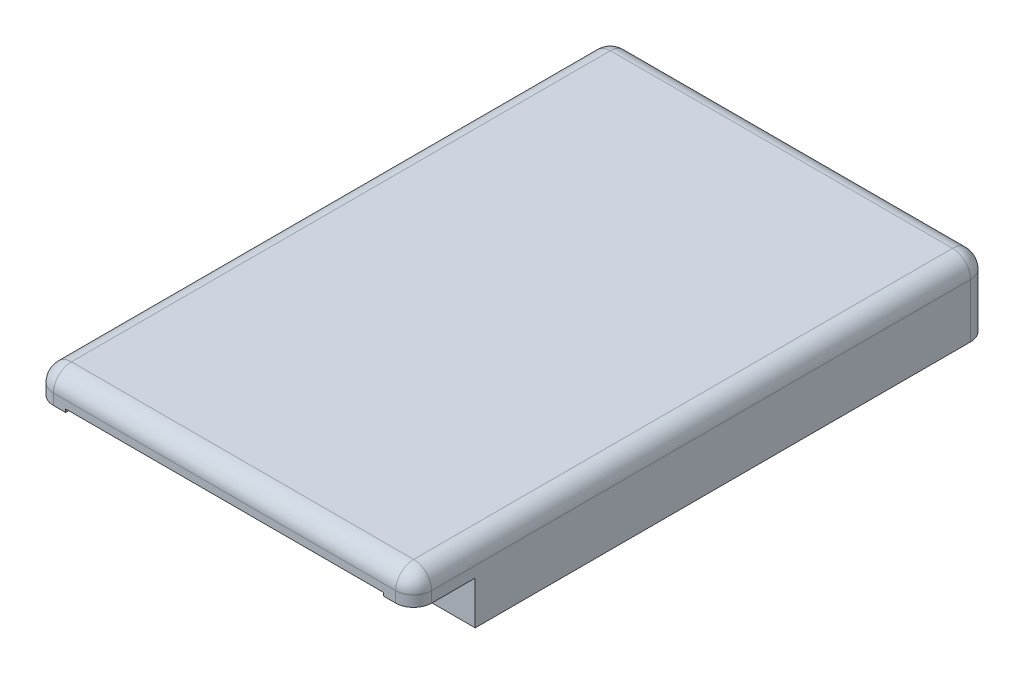
ISO-10303-21;
HEADER;
FILE_DESCRIPTION(('STEP AP214'),'2;1');
FILE_NAME('part.step','',(''),(''),'','','');
FILE_SCHEMA(('AUTOMOTIVE_DESIGN { 1 0 10303 214 1 1 1 1 }'));
ENDSEC;
DATA;
#1=APPLICATION_CONTEXT('core data for automotive mechanical design processes');
#2=APPLICATION_PROTOCOL_DEFINITION('international standard','automotive_design',2000,#1);
#3=PRODUCT_CONTEXT('',#1,'mechanical');
#4=PRODUCT('Part','Part','',(#3));
#5=PRODUCT_RELATED_PRODUCT_CATEGORY('part','',(#4));
#6=PRODUCT_DEFINITION_FORMATION('','',#4);
#7=PRODUCT_DEFINITION_CONTEXT('part definition',#1,'design');
#8=PRODUCT_DEFINITION('design','',#6,#7);
#9=PRODUCT_DEFINITION_SHAPE('','',#8);
#10=(LENGTH_UNIT() NAMED_UNIT(*) SI_UNIT(.MILLI.,.METRE.));
#11=(NAMED_UNIT(*) PLANE_ANGLE_UNIT() SI_UNIT($,.RADIAN.));
#12=(NAMED_UNIT(*) SI_UNIT($,.STERADIAN.) SOLID_ANGLE_UNIT());
#13=UNCERTAINTY_MEASURE_WITH_UNIT(LENGTH_MEASURE(1.E-05),#10,'distance_accuracy_value','');
#14=(GEOMETRIC_REPRESENTATION_CONTEXT(3) GLOBAL_UNCERTAINTY_ASSIGNED_CONTEXT((#13)) GLOBAL_UNIT_ASSIGNED_CONTEXT((#10,
#11,#12)) REPRESENTATION_CONTEXT('',''));
#15=CARTESIAN_POINT('',(0.,0.,0.));
#16=DIRECTION('',(0.,0.,1.));
#17=DIRECTION('',(1.,0.,0.));
#18=AXIS2_PLACEMENT_3D('',#15,#16,#17);
#19=CARTESIAN_POINT('',(0.,2.35,63.83));
#20=DIRECTION('',(-1.,0.,0.));
#21=DIRECTION('',(0.,0.,1.));
#22=AXIS2_PLACEMENT_3D('',#19,#20,#21);
#23=PLANE('',#22);
#24=DIRECTION('',(0.,0.,-1.));
#25=VECTOR('',#24,1.);
#26=CARTESIAN_POINT('',(0.,2.35,63.83));
#27=LINE('',#26,#25);
#28=CARTESIAN_POINT('',(0.,2.35,57.));
#29=VERTEX_POINT('',#28);
#30=CARTESIAN_POINT('',(0.,2.35,0.));
#31=VERTEX_POINT('',#30);
#32=EDGE_CURVE('E230',#29,#31,#27,.T.);
#33=ORIENTED_EDGE('',*,*,#32,.F.);
#34=DIRECTION('',(0.,-1.,0.));
#35=VECTOR('',#34,1.);
#36=CARTESIAN_POINT('',(0.,2.35,57.));
#37=LINE('',#36,#35);
#38=CARTESIAN_POINT('',(0.,0.,57.));
#39=VERTEX_POINT('',#38);
#40=EDGE_CURVE('E337',#29,#39,#37,.T.);
#41=ORIENTED_EDGE('',*,*,#40,.T.);
#42=DIRECTION('',(0.,0.,-1.));
#43=VECTOR('',#42,1.);
#44=CARTESIAN_POINT('',(0.,0.,63.83));
#45=LINE('',#44,#43);
#46=CARTESIAN_POINT('',(0.,0.,0.));
#47=VERTEX_POINT('',#46);
#48=EDGE_CURVE('E202',#39,#47,#45,.T.);
#49=ORIENTED_EDGE('',*,*,#48,.T.);
#50=DIRECTION('',(0.,1.,0.));
#51=VECTOR('',#50,1.);
#52=CARTESIAN_POINT('',(0.,2.35,0.));
#53=LINE('',#52,#51);
#54=EDGE_CURVE('E339',#47,#31,#53,.T.);
#55=ORIENTED_EDGE('',*,*,#54,.T.);
#56=EDGE_LOOP('',(#33,#41,#49,#55));
#57=FACE_BOUND('',#56,.T.);
#58=ADVANCED_FACE('F32',(#57),#23,.F.);
#59=CARTESIAN_POINT('',(-4.45,2.35,63.83));
#60=DIRECTION('',(0.,-1.,0.));
#61=DIRECTION('',(0.,0.,-1.));
#62=AXIS2_PLACEMENT_3D('',#59,#60,#61);
#63=PLANE('',#62);
#64=DIRECTION('',(0.,0.,-1.));
#65=VECTOR('',#64,1.);
#66=CARTESIAN_POINT('',(-4.45,2.35,63.83));
#67=LINE('',#66,#65);
#68=CARTESIAN_POINT('',(-4.45,2.35,57.));
#69=VERTEX_POINT('',#68);
#70=CARTESIAN_POINT('',(-4.45,2.35,0.));
#71=VERTEX_POINT('',#70);
#72=EDGE_CURVE('E228',#69,#71,#67,.T.);
#73=ORIENTED_EDGE('',*,*,#72,.F.);
#74=DIRECTION('',(1.,0.,0.));
#75=VECTOR('',#74,1.);
#76=CARTESIAN_POINT('',(-4.45,2.35,57.));
#77=LINE('',#76,#75);
#78=EDGE_CURVE('E334',#69,#29,#77,.T.);
#79=ORIENTED_EDGE('',*,*,#78,.T.);
#80=ORIENTED_EDGE('',*,*,#32,.T.);
#81=DIRECTION('',(-1.,0.,0.));
#82=VECTOR('',#81,1.);
#83=CARTESIAN_POINT('',(-4.45,2.35,0.));
#84=LINE('',#83,#82);
#85=EDGE_CURVE('E349',#31,#71,#84,.T.);
#86=ORIENTED_EDGE('',*,*,#85,.T.);
#87=EDGE_LOOP('',(#73,#79,#80,#86));
#88=FACE_BOUND('',#87,.T.);
#89=ADVANCED_FACE('F376',(#88),#63,.F.);
#90=CARTESIAN_POINT('',(-4.45,5.15,63.83));
#91=DIRECTION('',(-1.,0.,0.));
#92=DIRECTION('',(0.,0.,1.));
#93=AXIS2_PLACEMENT_3D('',#90,#91,#92);
#94=PLANE('',#93);
#95=DIRECTION('',(0.,1.,0.));
#96=VECTOR('',#95,1.);
#97=CARTESIAN_POINT('',(-4.45,5.15,63.83));
#98=LINE('',#97,#96);
#99=CARTESIAN_POINT('',(-4.45,4.8,63.83));
#100=VERTEX_POINT('',#99);
#101=CARTESIAN_POINT('',(-4.45,5.15,63.83));
#102=VERTEX_POINT('',#101);
#103=EDGE_CURVE('E340',#100,#102,#98,.T.);
#104=ORIENTED_EDGE('',*,*,#103,.F.);
#105=DIRECTION('',(0.,0.,-1.));
#106=VECTOR('',#105,1.);
#107=CARTESIAN_POINT('',(-4.45,4.8,63.83));
#108=LINE('',#107,#106);
#109=CARTESIAN_POINT('',(-4.45,4.8,57.));
#110=VERTEX_POINT('',#109);
#111=EDGE_CURVE('E319',#100,#110,#108,.T.);
#112=ORIENTED_EDGE('',*,*,#111,.T.);
#113=DIRECTION('',(0.,-1.,0.));
#114=VECTOR('',#113,1.);
#115=CARTESIAN_POINT('',(-4.45,5.15,57.));
#116=LINE('',#115,#114);
#117=EDGE_CURVE('E331',#110,#69,#116,.T.);
#118=ORIENTED_EDGE('',*,*,#117,.T.);
#119=ORIENTED_EDGE('',*,*,#72,.T.);
#120=DIRECTION('',(0.,1.,0.));
#121=VECTOR('',#120,1.);
#122=CARTESIAN_POINT('',(-4.45,5.15,0.));
#123=LINE('',#122,#121);
#124=CARTESIAN_POINT('',(-4.45,5.15,0.));
#125=VERTEX_POINT('',#124);
#126=EDGE_CURVE('E352',#71,#125,#123,.T.);
#127=ORIENTED_EDGE('',*,*,#126,.T.);
#128=DIRECTION('',(0.,0.,-1.));
#129=VECTOR('',#128,1.);
#130=CARTESIAN_POINT('',(-4.45,5.15,63.83));
#131=LINE('',#130,#129);
#132=EDGE_CURVE('E225',#102,#125,#131,.T.);
#133=ORIENTED_EDGE('',*,*,#132,.F.);
#134=EDGE_LOOP('',(#104,#112,#118,#119,#127,#133));
#135=FACE_BOUND('',#134,.T.);
#136=ADVANCED_FACE('F379',(#135),#94,.F.);
#137=CARTESIAN_POINT('',(-4.45,5.15,63.83));
#138=DIRECTION('',(0.,1.,0.));
#139=DIRECTION('',(0.,0.,1.));
#140=AXIS2_PLACEMENT_3D('',#137,#138,#139);
#141=PLANE('',#140);
#142=DIRECTION('',(1.,0.,0.));
#143=VECTOR('',#142,1.);
#144=CARTESIAN_POINT('',(-4.45,5.15,0.));
#145=LINE('',#144,#143);
#146=CARTESIAN_POINT('',(30.85,5.15,0.));
#147=VERTEX_POINT('',#146);
#148=EDGE_CURVE('E354',#125,#147,#145,.T.);
#149=ORIENTED_EDGE('',*,*,#148,.T.);
#150=DIRECTION('',(0.,0.,-1.));
#151=VECTOR('',#150,1.);
#152=CARTESIAN_POINT('',(30.85,5.15,63.83));
#153=LINE('',#152,#151);
#154=CARTESIAN_POINT('',(30.85,5.15,63.83));
#155=VERTEX_POINT('',#154);
#156=EDGE_CURVE('E222',#155,#147,#153,.T.);
#157=ORIENTED_EDGE('',*,*,#156,.F.);
#158=DIRECTION('',(1.,0.,0.));
#159=VECTOR('',#158,1.);
#160=CARTESIAN_POINT('',(-4.45,5.15,63.83));
#161=LINE('',#160,#159);
#162=EDGE_CURVE('E342',#102,#155,#161,.T.);
#163=ORIENTED_EDGE('',*,*,#162,.F.);
#164=ORIENTED_EDGE('',*,*,#132,.T.);
#165=EDGE_LOOP('',(#149,#157,#163,#164));
#166=FACE_BOUND('',#165,.T.);
#167=ADVANCED_FACE('F665',(#166),#141,.F.);
#168=CARTESIAN_POINT('',(30.85,5.15,63.83));
#169=DIRECTION('',(1.,0.,0.));
#170=DIRECTION('',(0.,0.,-1.));
#171=AXIS2_PLACEMENT_3D('',#168,#169,#170);
#172=PLANE('',#171);
#173=DIRECTION('',(0.,1.,0.));
#174=VECTOR('',#173,1.);
#175=CARTESIAN_POINT('',(30.85,5.15,57.));
#176=LINE('',#175,#174);
#177=CARTESIAN_POINT('',(30.85,2.35,57.));
#178=VERTEX_POINT('',#177);
#179=CARTESIAN_POINT('',(30.85,4.8,57.));
#180=VERTEX_POINT('',#179);
#181=EDGE_CURVE('E328',#178,#180,#176,.T.);
#182=ORIENTED_EDGE('',*,*,#181,.T.);
#183=DIRECTION('',(0.,0.,1.));
#184=VECTOR('',#183,1.);
#185=CARTESIAN_POINT('',(30.85,4.8,63.83));
#186=LINE('',#185,#184);
#187=CARTESIAN_POINT('',(30.85,4.8,63.83));
#188=VERTEX_POINT('',#187);
#189=EDGE_CURVE('E314',#180,#188,#186,.T.);
#190=ORIENTED_EDGE('',*,*,#189,.T.);
#191=DIRECTION('',(0.,-1.,0.));
#192=VECTOR('',#191,1.);
#193=CARTESIAN_POINT('',(30.85,5.15,63.83));
#194=LINE('',#193,#192);
#195=EDGE_CURVE('E213',#155,#188,#194,.T.);
#196=ORIENTED_EDGE('',*,*,#195,.F.);
#197=ORIENTED_EDGE('',*,*,#156,.T.);
#198=DIRECTION('',(0.,-1.,0.));
#199=VECTOR('',#198,1.);
#200=CARTESIAN_POINT('',(30.85,5.15,0.));
#201=LINE('',#200,#199);
#202=CARTESIAN_POINT('',(30.85,2.35,0.));
#203=VERTEX_POINT('',#202);
#204=EDGE_CURVE('E356',#147,#203,#201,.T.);
#205=ORIENTED_EDGE('',*,*,#204,.T.);
#206=DIRECTION('',(0.,0.,-1.));
#207=VECTOR('',#206,1.);
#208=CARTESIAN_POINT('',(30.85,2.35,63.83));
#209=LINE('',#208,#207);
#210=EDGE_CURVE('E220',#178,#203,#209,.T.);
#211=ORIENTED_EDGE('',*,*,#210,.F.);
#212=EDGE_LOOP('',(#182,#190,#196,#197,#205,#211));
#213=FACE_BOUND('',#212,.T.);
#214=ADVANCED_FACE('F411',(#213),#172,.F.);
#215=CARTESIAN_POINT('',(30.85,2.35,63.83));
#216=DIRECTION('',(0.,-1.,0.));
#217=DIRECTION('',(1.,0.,0.));
#218=AXIS2_PLACEMENT_3D('',#215,#216,#217);
#219=PLANE('',#218);
#220=DIRECTION('',(0.,0.,-1.));
#221=VECTOR('',#220,1.);
#222=CARTESIAN_POINT('',(26.4,2.35,63.83));
#223=LINE('',#222,#221);
#224=CARTESIAN_POINT('',(26.4,2.35,57.));
#225=VERTEX_POINT('',#224);
#226=CARTESIAN_POINT('',(26.4,2.35,0.));
#227=VERTEX_POINT('',#226);
#228=EDGE_CURVE('E218',#225,#227,#223,.T.);
#229=ORIENTED_EDGE('',*,*,#228,.F.);
#230=DIRECTION('',(1.,0.,0.));
#231=VECTOR('',#230,1.);
#232=CARTESIAN_POINT('',(30.85,2.35,57.));
#233=LINE('',#232,#231);
#234=EDGE_CURVE('E325',#225,#178,#233,.T.);
#235=ORIENTED_EDGE('',*,*,#234,.T.);
#236=ORIENTED_EDGE('',*,*,#210,.T.);
#237=DIRECTION('',(-1.,0.,0.));
#238=VECTOR('',#237,1.);
#239=CARTESIAN_POINT('',(30.85,2.35,0.));
#240=LINE('',#239,#238);
#241=EDGE_CURVE('E359',#203,#227,#240,.T.);
#242=ORIENTED_EDGE('',*,*,#241,.T.);
#243=EDGE_LOOP('',(#229,#235,#236,#242));
#244=FACE_BOUND('',#243,.T.);
#245=ADVANCED_FACE('F416',(#244),#219,.F.);
#246=CARTESIAN_POINT('',(26.4,2.35,63.83));
#247=DIRECTION('',(1.,0.,0.));
#248=DIRECTION('',(0.,0.,-1.));
#249=AXIS2_PLACEMENT_3D('',#246,#247,#248);
#250=PLANE('',#249);
#251=DIRECTION('',(0.,0.,-1.));
#252=VECTOR('',#251,1.);
#253=CARTESIAN_POINT('',(26.4,0.,63.83));
#254=LINE('',#253,#252);
#255=CARTESIAN_POINT('',(26.4,0.,57.));
#256=VERTEX_POINT('',#255);
#257=CARTESIAN_POINT('',(26.4,0.,0.));
#258=VERTEX_POINT('',#257);
#259=EDGE_CURVE('E211',#256,#258,#254,.T.);
#260=ORIENTED_EDGE('',*,*,#259,.F.);
#261=DIRECTION('',(0.,1.,0.));
#262=VECTOR('',#261,1.);
#263=CARTESIAN_POINT('',(26.4,2.35,57.));
#264=LINE('',#263,#262);
#265=EDGE_CURVE('E322',#256,#225,#264,.T.);
#266=ORIENTED_EDGE('',*,*,#265,.T.);
#267=ORIENTED_EDGE('',*,*,#228,.T.);
#268=DIRECTION('',(0.,-1.,0.));
#269=VECTOR('',#268,1.);
#270=CARTESIAN_POINT('',(26.4,2.35,0.));
#271=LINE('',#270,#269);
#272=EDGE_CURVE('E362',#227,#258,#271,.T.);
#273=ORIENTED_EDGE('',*,*,#272,.T.);
#274=EDGE_LOOP('',(#260,#266,#267,#273));
#275=FACE_BOUND('',#274,.T.);
#276=ADVANCED_FACE('F421',(#275),#250,.F.);
#277=CARTESIAN_POINT('',(34.2,0.,63.83));
#278=DIRECTION('',(0.,1.,0.));
#279=DIRECTION('',(-1.,0.,0.));
#280=AXIS2_PLACEMENT_3D('',#277,#278,#279);
#281=PLANE('',#280);
#282=DIRECTION('',(1.,0.,0.));
#283=VECTOR('',#282,1.);
#284=CARTESIAN_POINT('',(34.2,0.,0.));
#285=LINE('',#284,#283);
#286=CARTESIAN_POINT('',(32.2,0.,0.));
#287=VERTEX_POINT('',#286);
#288=EDGE_CURVE('E365',#258,#287,#285,.T.);
#289=ORIENTED_EDGE('',*,*,#288,.T.);
#290=CARTESIAN_POINT('',(32.2,0.,2.));
#291=DIRECTION('',(0.,1.,0.));
#292=DIRECTION('',(-1.,0.,0.));
#293=AXIS2_PLACEMENT_3D('',#290,#291,#292);
#294=CIRCLE('',#293,2.);
#295=CARTESIAN_POINT('',(34.2,0.,2.));
#296=VERTEX_POINT('',#295);
#297=EDGE_CURVE('E267',#287,#296,#294,.F.);
#298=ORIENTED_EDGE('',*,*,#297,.T.);
#299=DIRECTION('',(0.,0.,-1.));
#300=VECTOR('',#299,1.);
#301=CARTESIAN_POINT('',(34.2,0.,63.83));
#302=LINE('',#301,#300);
#303=CARTESIAN_POINT('',(34.2,0.,57.));
#304=VERTEX_POINT('',#303);
#305=EDGE_CURVE('E208',#304,#296,#302,.T.);
#306=ORIENTED_EDGE('',*,*,#305,.F.);
#307=DIRECTION('',(1.,0.,0.));
#308=VECTOR('',#307,1.);
#309=CARTESIAN_POINT('',(34.2,0.,57.));
#310=LINE('',#309,#308);
#311=EDGE_CURVE('E192',#256,#304,#310,.T.);
#312=ORIENTED_EDGE('',*,*,#311,.F.);
#313=ORIENTED_EDGE('',*,*,#259,.T.);
#314=EDGE_LOOP('',(#289,#298,#306,#312,#313));
#315=FACE_BOUND('',#314,.T.);
#316=ADVANCED_FACE('F424',(#315),#281,.F.);
#317=CARTESIAN_POINT('',(34.2,8.,63.83));
#318=DIRECTION('',(-1.,0.,0.));
#319=DIRECTION('',(0.,-1.,0.));
#320=AXIS2_PLACEMENT_3D('',#317,#318,#319);
#321=PLANE('',#320);
#322=ORIENTED_EDGE('',*,*,#305,.T.);
#323=DIRECTION('',(0.,1.,0.));
#324=VECTOR('',#323,1.);
#325=CARTESIAN_POINT('',(34.2,8.,2.));
#326=LINE('',#325,#324);
#327=CARTESIAN_POINT('',(34.2,6.,2.));
#328=VERTEX_POINT('',#327);
#329=EDGE_CURVE('E248',#296,#328,#326,.T.);
#330=ORIENTED_EDGE('',*,*,#329,.T.);
#331=DIRECTION('',(0.,0.,-1.));
#332=VECTOR('',#331,1.);
#333=CARTESIAN_POINT('',(34.2,6.,63.83));
#334=LINE('',#333,#332);
#335=CARTESIAN_POINT('',(34.2,6.,61.83));
#336=VERTEX_POINT('',#335);
#337=EDGE_CURVE('E245',#328,#336,#334,.F.);
#338=ORIENTED_EDGE('',*,*,#337,.T.);
#339=DIRECTION('',(0.,1.,0.));
#340=VECTOR('',#339,1.);
#341=CARTESIAN_POINT('',(34.2,8.,61.83));
#342=LINE('',#341,#340);
#343=CARTESIAN_POINT('',(34.2,4.8,61.83));
#344=VERTEX_POINT('',#343);
#345=EDGE_CURVE('E243',#336,#344,#342,.F.);
#346=ORIENTED_EDGE('',*,*,#345,.T.);
#347=DIRECTION('',(0.,0.,1.));
#348=VECTOR('',#347,1.);
#349=CARTESIAN_POINT('',(34.2,4.8,57.));
#350=LINE('',#349,#348);
#351=CARTESIAN_POINT('',(34.2,4.8,57.));
#352=VERTEX_POINT('',#351);
#353=EDGE_CURVE('E315',#352,#344,#350,.T.);
#354=ORIENTED_EDGE('',*,*,#353,.F.);
#355=DIRECTION('',(0.,1.,0.));
#356=VECTOR('',#355,1.);
#357=CARTESIAN_POINT('',(34.2,4.8,57.));
#358=LINE('',#357,#356);
#359=EDGE_CURVE('E203',#304,#352,#358,.T.);
#360=ORIENTED_EDGE('',*,*,#359,.F.);
#361=EDGE_LOOP('',(#322,#330,#338,#346,#354,#360));
#362=FACE_BOUND('',#361,.T.);
#363=ADVANCED_FACE('F397',(#362),#321,.F.);
#364=CARTESIAN_POINT('',(-7.8,8.,63.83));
#365=DIRECTION('',(0.,-1.,0.));
#366=DIRECTION('',(0.,0.,-1.));
#367=AXIS2_PLACEMENT_3D('',#364,#365,#366);
#368=PLANE('',#367);
#369=DIRECTION('',(-1.,0.,0.));
#370=VECTOR('',#369,1.);
#371=CARTESIAN_POINT('',(-7.8,8.,61.83));
#372=LINE('',#371,#370);
#373=CARTESIAN_POINT('',(-5.8,8.,61.83));
#374=VERTEX_POINT('',#373);
#375=CARTESIAN_POINT('',(32.2,8.,61.83));
#376=VERTEX_POINT('',#375);
#377=EDGE_CURVE('E238',#374,#376,#372,.F.);
#378=ORIENTED_EDGE('',*,*,#377,.T.);
#379=DIRECTION('',(0.,0.,-1.));
#380=VECTOR('',#379,1.);
#381=CARTESIAN_POINT('',(32.2,8.,63.83));
#382=LINE('',#381,#380);
#383=CARTESIAN_POINT('',(32.2,8.,2.));
#384=VERTEX_POINT('',#383);
#385=EDGE_CURVE('E240',#376,#384,#382,.T.);
#386=ORIENTED_EDGE('',*,*,#385,.T.);
#387=DIRECTION('',(-1.,0.,0.));
#388=VECTOR('',#387,1.);
#389=CARTESIAN_POINT('',(-7.8,8.,2.));
#390=LINE('',#389,#388);
#391=CARTESIAN_POINT('',(-5.8,8.,2.));
#392=VERTEX_POINT('',#391);
#393=EDGE_CURVE('E234',#384,#392,#390,.T.);
#394=ORIENTED_EDGE('',*,*,#393,.T.);
#395=DIRECTION('',(0.,0.,-1.));
#396=VECTOR('',#395,1.);
#397=CARTESIAN_POINT('',(-5.8,8.,63.83));
#398=LINE('',#397,#396);
#399=EDGE_CURVE('E236',#392,#374,#398,.F.);
#400=ORIENTED_EDGE('',*,*,#399,.T.);
#401=EDGE_LOOP('',(#378,#386,#394,#400));
#402=FACE_BOUND('',#401,.T.);
#403=ADVANCED_FACE('F444',(#402),#368,.F.);
#404=CARTESIAN_POINT('',(-7.8,0.,63.83));
#405=DIRECTION('',(1.,0.,0.));
#406=DIRECTION('',(0.,1.,0.));
#407=AXIS2_PLACEMENT_3D('',#404,#405,#406);
#408=PLANE('',#407);
#409=DIRECTION('',(0.,0.,-1.));
#410=VECTOR('',#409,1.);
#411=CARTESIAN_POINT('',(-7.8,6.,63.83));
#412=LINE('',#411,#410);
#413=CARTESIAN_POINT('',(-7.8,6.,61.83));
#414=VERTEX_POINT('',#413);
#415=CARTESIAN_POINT('',(-7.8,6.,2.));
#416=VERTEX_POINT('',#415);
#417=EDGE_CURVE('E258',#414,#416,#412,.T.);
#418=ORIENTED_EDGE('',*,*,#417,.T.);
#419=DIRECTION('',(0.,-1.,0.));
#420=VECTOR('',#419,1.);
#421=CARTESIAN_POINT('',(-7.8,0.,2.));
#422=LINE('',#421,#420);
#423=CARTESIAN_POINT('',(-7.8,0.,2.));
#424=VERTEX_POINT('',#423);
#425=EDGE_CURVE('E207',#416,#424,#422,.T.);
#426=ORIENTED_EDGE('',*,*,#425,.T.);
#427=DIRECTION('',(0.,0.,-1.));
#428=VECTOR('',#427,1.);
#429=CARTESIAN_POINT('',(-7.8,0.,63.83));
#430=LINE('',#429,#428);
#431=CARTESIAN_POINT('',(-7.8,0.,57.));
#432=VERTEX_POINT('',#431);
#433=EDGE_CURVE('E199',#432,#424,#430,.T.);
#434=ORIENTED_EDGE('',*,*,#433,.F.);
#435=DIRECTION('',(0.,-1.,0.));
#436=VECTOR('',#435,1.);
#437=CARTESIAN_POINT('',(-7.8,0.,57.));
#438=LINE('',#437,#436);
#439=CARTESIAN_POINT('',(-7.8,4.8,57.));
#440=VERTEX_POINT('',#439);
#441=EDGE_CURVE('E181',#440,#432,#438,.T.);
#442=ORIENTED_EDGE('',*,*,#441,.F.);
#443=DIRECTION('',(0.,0.,1.));
#444=VECTOR('',#443,1.);
#445=CARTESIAN_POINT('',(-7.8,4.8,57.));
#446=LINE('',#445,#444);
#447=CARTESIAN_POINT('',(-7.8,4.8,61.83));
#448=VERTEX_POINT('',#447);
#449=EDGE_CURVE('E312',#440,#448,#446,.T.);
#450=ORIENTED_EDGE('',*,*,#449,.T.);
#451=DIRECTION('',(0.,-1.,0.));
#452=VECTOR('',#451,1.);
#453=CARTESIAN_POINT('',(-7.8,0.,61.83));
#454=LINE('',#453,#452);
#455=EDGE_CURVE('E256',#448,#414,#454,.F.);
#456=ORIENTED_EDGE('',*,*,#455,.T.);
#457=EDGE_LOOP('',(#418,#426,#434,#442,#450,#456));
#458=FACE_BOUND('',#457,.T.);
#459=ADVANCED_FACE('F205',(#458),#408,.F.);
#460=CARTESIAN_POINT('',(0.,0.,63.83));
#461=DIRECTION('',(0.,1.,0.));
#462=DIRECTION('',(-1.,0.,0.));
#463=AXIS2_PLACEMENT_3D('',#460,#461,#462);
#464=PLANE('',#463);
#465=ORIENTED_EDGE('',*,*,#433,.T.);
#466=CARTESIAN_POINT('',(-5.8,0.,2.));
#467=DIRECTION('',(0.,1.,0.));
#468=DIRECTION('',(-1.,0.,0.));
#469=AXIS2_PLACEMENT_3D('',#466,#467,#468);
#470=CIRCLE('',#469,2.);
#471=CARTESIAN_POINT('',(-5.8,0.,0.));
#472=VERTEX_POINT('',#471);
#473=EDGE_CURVE('E265',#424,#472,#470,.F.);
#474=ORIENTED_EDGE('',*,*,#473,.T.);
#475=DIRECTION('',(1.,0.,0.));
#476=VECTOR('',#475,1.);
#477=CARTESIAN_POINT('',(0.,0.,0.));
#478=LINE('',#477,#476);
#479=EDGE_CURVE('E343',#472,#47,#478,.T.);
#480=ORIENTED_EDGE('',*,*,#479,.T.);
#481=ORIENTED_EDGE('',*,*,#48,.F.);
#482=EDGE_CURVE('E184',#432,#39,#310,.T.);
#483=ORIENTED_EDGE('',*,*,#482,.F.);
#484=EDGE_LOOP('',(#465,#474,#480,#481,#483));
#485=FACE_BOUND('',#484,.T.);
#486=ADVANCED_FACE('F198',(#485),#464,.F.);
#487=CARTESIAN_POINT('',(0.,0.,63.83));
#488=DIRECTION('',(0.,0.,-1.));
#489=DIRECTION('',(-1.,0.,0.));
#490=AXIS2_PLACEMENT_3D('',#487,#488,#489);
#491=PLANE('',#490);
#492=DIRECTION('',(-1.,0.,0.));
#493=VECTOR('',#492,1.);
#494=CARTESIAN_POINT('',(0.,6.,63.83));
#495=LINE('',#494,#493);
#496=CARTESIAN_POINT('',(32.2,6.,63.83));
#497=VERTEX_POINT('',#496);
#498=CARTESIAN_POINT('',(-5.8,6.,63.83));
#499=VERTEX_POINT('',#498);
#500=EDGE_CURVE('E252',#497,#499,#495,.T.);
#501=ORIENTED_EDGE('',*,*,#500,.T.);
#502=DIRECTION('',(0.,-1.,0.));
#503=VECTOR('',#502,1.);
#504=CARTESIAN_POINT('',(-5.8,0.,63.83));
#505=LINE('',#504,#503);
#506=CARTESIAN_POINT('',(-5.8,4.8,63.83));
#507=VERTEX_POINT('',#506);
#508=EDGE_CURVE('E254',#499,#507,#505,.T.);
#509=ORIENTED_EDGE('',*,*,#508,.T.);
#510=DIRECTION('',(1.,0.,0.));
#511=VECTOR('',#510,1.);
#512=CARTESIAN_POINT('',(0.,4.8,63.83));
#513=LINE('',#512,#511);
#514=EDGE_CURVE('E232',#507,#100,#513,.T.);
#515=ORIENTED_EDGE('',*,*,#514,.T.);
#516=ORIENTED_EDGE('',*,*,#103,.T.);
#517=ORIENTED_EDGE('',*,*,#162,.T.);
#518=ORIENTED_EDGE('',*,*,#195,.T.);
#519=DIRECTION('',(-1.,0.,0.));
#520=VECTOR('',#519,1.);
#521=CARTESIAN_POINT('',(-7.8,4.8,63.83));
#522=LINE('',#521,#520);
#523=CARTESIAN_POINT('',(32.2,4.8,63.83));
#524=VERTEX_POINT('',#523);
#525=EDGE_CURVE('E193',#524,#188,#522,.T.);
#526=ORIENTED_EDGE('',*,*,#525,.F.);
#527=DIRECTION('',(0.,1.,0.));
#528=VECTOR('',#527,1.);
#529=CARTESIAN_POINT('',(32.2,0.,63.83));
#530=LINE('',#529,#528);
#531=EDGE_CURVE('E250',#524,#497,#530,.T.);
#532=ORIENTED_EDGE('',*,*,#531,.T.);
#533=EDGE_LOOP('',(#501,#509,#515,#516,#517,#518,#526,#532));
#534=FACE_BOUND('',#533,.T.);
#535=ADVANCED_FACE('F405',(#534),#491,.F.);
#536=CARTESIAN_POINT('',(0.,0.,0.));
#537=DIRECTION('',(0.,0.,-1.));
#538=DIRECTION('',(-1.,0.,0.));
#539=AXIS2_PLACEMENT_3D('',#536,#537,#538);
#540=PLANE('',#539);
#541=ORIENTED_EDGE('',*,*,#479,.F.);
#542=DIRECTION('',(0.,-1.,0.));
#543=VECTOR('',#542,1.);
#544=CARTESIAN_POINT('',(-5.8,8.,0.));
#545=LINE('',#544,#543);
#546=CARTESIAN_POINT('',(-5.8,6.,0.));
#547=VERTEX_POINT('',#546);
#548=EDGE_CURVE('E49',#472,#547,#545,.F.);
#549=ORIENTED_EDGE('',*,*,#548,.T.);
#550=DIRECTION('',(-1.,0.,0.));
#551=VECTOR('',#550,1.);
#552=CARTESIAN_POINT('',(34.2,6.,0.));
#553=LINE('',#552,#551);
#554=CARTESIAN_POINT('',(32.2,6.,0.));
#555=VERTEX_POINT('',#554);
#556=EDGE_CURVE('E54',#547,#555,#553,.F.);
#557=ORIENTED_EDGE('',*,*,#556,.T.);
#558=DIRECTION('',(0.,1.,0.));
#559=VECTOR('',#558,1.);
#560=CARTESIAN_POINT('',(32.2,0.,0.));
#561=LINE('',#560,#559);
#562=EDGE_CURVE('E261',#555,#287,#561,.F.);
#563=ORIENTED_EDGE('',*,*,#562,.T.);
#564=ORIENTED_EDGE('',*,*,#288,.F.);
#565=ORIENTED_EDGE('',*,*,#272,.F.);
#566=ORIENTED_EDGE('',*,*,#241,.F.);
#567=ORIENTED_EDGE('',*,*,#204,.F.);
#568=ORIENTED_EDGE('',*,*,#148,.F.);
#569=ORIENTED_EDGE('',*,*,#126,.F.);
#570=ORIENTED_EDGE('',*,*,#85,.F.);
#571=ORIENTED_EDGE('',*,*,#54,.F.);
#572=EDGE_LOOP('',(#541,#549,#557,#563,#564,#565,#566,#567,#568,#569,#570,#571));
#573=FACE_BOUND('',#572,.T.);
#574=ADVANCED_FACE('F371',(#573),#540,.T.);
#575=CARTESIAN_POINT('',(-7.8,4.8,57.));
#576=DIRECTION('',(0.,1.,0.));
#577=DIRECTION('',(0.,0.,1.));
#578=AXIS2_PLACEMENT_3D('',#575,#576,#577);
#579=PLANE('',#578);
#580=ORIENTED_EDGE('',*,*,#353,.T.);
#581=CARTESIAN_POINT('',(32.2,4.8,61.83));
#582=DIRECTION('',(0.,1.,0.));
#583=DIRECTION('',(0.,0.,1.));
#584=AXIS2_PLACEMENT_3D('',#581,#582,#583);
#585=CIRCLE('',#584,2.);
#586=EDGE_CURVE('E11',#344,#524,#585,.F.);
#587=ORIENTED_EDGE('',*,*,#586,.T.);
#588=ORIENTED_EDGE('',*,*,#525,.T.);
#589=ORIENTED_EDGE('',*,*,#189,.F.);
#590=DIRECTION('',(-1.,0.,0.));
#591=VECTOR('',#590,1.);
#592=CARTESIAN_POINT('',(-7.8,4.8,57.));
#593=LINE('',#592,#591);
#594=EDGE_CURVE('E310',#352,#180,#593,.T.);
#595=ORIENTED_EDGE('',*,*,#594,.F.);
#596=EDGE_LOOP('',(#580,#587,#588,#589,#595));
#597=FACE_BOUND('',#596,.T.);
#598=ADVANCED_FACE('F395',(#597),#579,.F.);
#599=CARTESIAN_POINT('',(0.,0.,57.));
#600=DIRECTION('',(0.,0.,-1.));
#601=DIRECTION('',(-1.,0.,0.));
#602=AXIS2_PLACEMENT_3D('',#599,#600,#601);
#603=PLANE('',#602);
#604=ORIENTED_EDGE('',*,*,#234,.F.);
#605=ORIENTED_EDGE('',*,*,#265,.F.);
#606=ORIENTED_EDGE('',*,*,#311,.T.);
#607=ORIENTED_EDGE('',*,*,#359,.T.);
#608=ORIENTED_EDGE('',*,*,#594,.T.);
#609=ORIENTED_EDGE('',*,*,#181,.F.);
#610=EDGE_LOOP('',(#604,#605,#606,#607,#608,#609));
#611=FACE_BOUND('',#610,.T.);
#612=ADVANCED_FACE('F390',(#611),#603,.F.);
#613=ORIENTED_EDGE('',*,*,#78,.F.);
#614=ORIENTED_EDGE('',*,*,#117,.F.);
#615=EDGE_CURVE('E187',#110,#440,#593,.T.);
#616=ORIENTED_EDGE('',*,*,#615,.T.);
#617=ORIENTED_EDGE('',*,*,#441,.T.);
#618=ORIENTED_EDGE('',*,*,#482,.T.);
#619=ORIENTED_EDGE('',*,*,#40,.F.);
#620=EDGE_LOOP('',(#613,#614,#616,#617,#618,#619));
#621=FACE_BOUND('',#620,.T.);
#622=ADVANCED_FACE('F183',(#621),#603,.F.);
#623=ORIENTED_EDGE('',*,*,#514,.F.);
#624=CARTESIAN_POINT('',(-5.8,4.8,61.83));
#625=DIRECTION('',(0.,1.,0.));
#626=DIRECTION('',(0.,0.,1.));
#627=AXIS2_PLACEMENT_3D('',#624,#625,#626);
#628=CIRCLE('',#627,2.);
#629=EDGE_CURVE('E41',#507,#448,#628,.F.);
#630=ORIENTED_EDGE('',*,*,#629,.T.);
#631=ORIENTED_EDGE('',*,*,#449,.F.);
#632=ORIENTED_EDGE('',*,*,#615,.F.);
#633=ORIENTED_EDGE('',*,*,#111,.F.);
#634=EDGE_LOOP('',(#623,#630,#631,#632,#633));
#635=FACE_BOUND('',#634,.T.);
#636=ADVANCED_FACE('F384',(#635),#579,.F.);
#637=CARTESIAN_POINT('',(-5.8,0.,61.83));
#638=DIRECTION('',(0.,-1.,0.));
#639=DIRECTION('',(1.,0.,0.));
#640=AXIS2_PLACEMENT_3D('',#637,#638,#639);
#641=CYLINDRICAL_SURFACE('',#640,2.);
#642=ORIENTED_EDGE('',*,*,#629,.F.);
#643=ORIENTED_EDGE('',*,*,#508,.F.);
#644=CARTESIAN_POINT('',(-5.8,6.,61.83));
#645=DIRECTION('',(0.,1.,0.));
#646=DIRECTION('',(0.,0.,1.));
#647=AXIS2_PLACEMENT_3D('',#644,#645,#646);
#648=CIRCLE('',#647,2.);
#649=EDGE_CURVE('E36',#414,#499,#648,.T.);
#650=ORIENTED_EDGE('',*,*,#649,.F.);
#651=ORIENTED_EDGE('',*,*,#455,.F.);
#652=EDGE_LOOP('',(#642,#643,#650,#651));
#653=FACE_BOUND('',#652,.T.);
#654=ADVANCED_FACE('F34',(#653),#641,.T.);
#655=CARTESIAN_POINT('',(-5.8,6.,63.83));
#656=DIRECTION('',(0.,0.,-1.));
#657=DIRECTION('',(-1.,0.,0.));
#658=AXIS2_PLACEMENT_3D('',#655,#656,#657);
#659=CYLINDRICAL_SURFACE('',#658,2.);
#660=CARTESIAN_POINT('',(-5.8,6.,2.));
#661=DIRECTION('',(0.,0.,-1.));
#662=DIRECTION('',(-1.,0.,0.));
#663=AXIS2_PLACEMENT_3D('',#660,#661,#662);
#664=CIRCLE('',#663,2.);
#665=EDGE_CURVE('E295',#416,#392,#664,.T.);
#666=ORIENTED_EDGE('',*,*,#665,.F.);
#667=ORIENTED_EDGE('',*,*,#417,.F.);
#668=CARTESIAN_POINT('',(-5.8,6.,61.83));
#669=DIRECTION('',(0.,0.,1.));
#670=DIRECTION('',(1.,0.,0.));
#671=AXIS2_PLACEMENT_3D('',#668,#669,#670);
#672=CIRCLE('',#671,2.);
#673=EDGE_CURVE('E297',#374,#414,#672,.T.);
#674=ORIENTED_EDGE('',*,*,#673,.F.);
#675=ORIENTED_EDGE('',*,*,#399,.F.);
#676=EDGE_LOOP('',(#666,#667,#674,#675));
#677=FACE_BOUND('',#676,.T.);
#678=ADVANCED_FACE('F537',(#677),#659,.T.);
#679=CARTESIAN_POINT('',(-5.8,0.,2.));
#680=DIRECTION('',(0.,1.,0.));
#681=DIRECTION('',(-1.,0.,0.));
#682=AXIS2_PLACEMENT_3D('',#679,#680,#681);
#683=CYLINDRICAL_SURFACE('',#682,2.);
#684=ORIENTED_EDGE('',*,*,#473,.F.);
#685=ORIENTED_EDGE('',*,*,#425,.F.);
#686=CARTESIAN_POINT('',(-5.8,6.,2.));
#687=DIRECTION('',(0.,1.,0.));
#688=DIRECTION('',(0.,0.,1.));
#689=AXIS2_PLACEMENT_3D('',#686,#687,#688);
#690=CIRCLE('',#689,2.);
#691=EDGE_CURVE('E292',#547,#416,#690,.T.);
#692=ORIENTED_EDGE('',*,*,#691,.F.);
#693=ORIENTED_EDGE('',*,*,#548,.F.);
#694=EDGE_LOOP('',(#684,#685,#692,#693));
#695=FACE_BOUND('',#694,.T.);
#696=ADVANCED_FACE('F528',(#695),#683,.T.);
#697=CARTESIAN_POINT('',(-5.8,6.,61.83));
#698=DIRECTION('',(0.,0.,1.));
#699=DIRECTION('',(1.,0.,0.));
#700=AXIS2_PLACEMENT_3D('',#697,#698,#699);
#701=SPHERICAL_SURFACE('',#700,2.);
#702=ORIENTED_EDGE('',*,*,#673,.T.);
#703=ORIENTED_EDGE('',*,*,#649,.T.);
#704=CARTESIAN_POINT('',(-5.8,6.,61.83));
#705=DIRECTION('',(-1.,0.,0.));
#706=DIRECTION('',(0.,0.,1.));
#707=AXIS2_PLACEMENT_3D('',#704,#705,#706);
#708=CIRCLE('',#707,2.);
#709=EDGE_CURVE('E289',#374,#499,#708,.F.);
#710=ORIENTED_EDGE('',*,*,#709,.F.);
#711=EDGE_LOOP('',(#702,#703,#710));
#712=FACE_BOUND('',#711,.T.);
#713=ADVANCED_FACE('F518',(#712),#701,.T.);
#714=CARTESIAN_POINT('',(-5.8,6.,2.));
#715=DIRECTION('',(0.,0.,1.));
#716=DIRECTION('',(1.,0.,0.));
#717=AXIS2_PLACEMENT_3D('',#714,#715,#716);
#718=SPHERICAL_SURFACE('',#717,2.);
#719=ORIENTED_EDGE('',*,*,#691,.T.);
#720=ORIENTED_EDGE('',*,*,#665,.T.);
#721=CARTESIAN_POINT('',(-5.8,6.,2.));
#722=DIRECTION('',(-1.,0.,0.));
#723=DIRECTION('',(0.,0.,1.));
#724=AXIS2_PLACEMENT_3D('',#721,#722,#723);
#725=CIRCLE('',#724,2.);
#726=EDGE_CURVE('E286',#547,#392,#725,.F.);
#727=ORIENTED_EDGE('',*,*,#726,.F.);
#728=EDGE_LOOP('',(#719,#720,#727));
#729=FACE_BOUND('',#728,.T.);
#730=ADVANCED_FACE('F509',(#729),#718,.T.);
#731=CARTESIAN_POINT('',(32.2,0.,61.83));
#732=DIRECTION('',(0.,1.,0.));
#733=DIRECTION('',(-1.,0.,0.));
#734=AXIS2_PLACEMENT_3D('',#731,#732,#733);
#735=CYLINDRICAL_SURFACE('',#734,2.);
#736=ORIENTED_EDGE('',*,*,#586,.F.);
#737=ORIENTED_EDGE('',*,*,#345,.F.);
#738=CARTESIAN_POINT('',(32.2,6.,61.83));
#739=DIRECTION('',(0.,1.,0.));
#740=DIRECTION('',(-1.,0.,0.));
#741=AXIS2_PLACEMENT_3D('',#738,#739,#740);
#742=CIRCLE('',#741,2.);
#743=EDGE_CURVE('E283',#497,#336,#742,.T.);
#744=ORIENTED_EDGE('',*,*,#743,.F.);
#745=ORIENTED_EDGE('',*,*,#531,.F.);
#746=EDGE_LOOP('',(#736,#737,#744,#745));
#747=FACE_BOUND('',#746,.T.);
#748=ADVANCED_FACE('F402',(#747),#735,.T.);
#749=CARTESIAN_POINT('',(0.,6.,61.83));
#750=DIRECTION('',(-1.,0.,0.));
#751=DIRECTION('',(0.,0.,1.));
#752=AXIS2_PLACEMENT_3D('',#749,#750,#751);
#753=CYLINDRICAL_SURFACE('',#752,2.);
#754=ORIENTED_EDGE('',*,*,#709,.T.);
#755=ORIENTED_EDGE('',*,*,#500,.F.);
#756=CARTESIAN_POINT('',(32.2,6.,61.83));
#757=DIRECTION('',(1.,0.,0.));
#758=DIRECTION('',(0.,0.,-1.));
#759=AXIS2_PLACEMENT_3D('',#756,#757,#758);
#760=CIRCLE('',#759,2.);
#761=EDGE_CURVE('E280',#376,#497,#760,.T.);
#762=ORIENTED_EDGE('',*,*,#761,.F.);
#763=ORIENTED_EDGE('',*,*,#377,.F.);
#764=EDGE_LOOP('',(#754,#755,#762,#763));
#765=FACE_BOUND('',#764,.T.);
#766=ADVANCED_FACE('F448',(#765),#753,.T.);
#767=CARTESIAN_POINT('',(-7.8,6.,2.));
#768=DIRECTION('',(1.,0.,0.));
#769=DIRECTION('',(0.,0.,-1.));
#770=AXIS2_PLACEMENT_3D('',#767,#768,#769);
#771=CYLINDRICAL_SURFACE('',#770,2.);
#772=ORIENTED_EDGE('',*,*,#726,.T.);
#773=ORIENTED_EDGE('',*,*,#393,.F.);
#774=CARTESIAN_POINT('',(32.2,6.,2.));
#775=DIRECTION('',(1.,0.,0.));
#776=DIRECTION('',(0.,0.,-1.));
#777=AXIS2_PLACEMENT_3D('',#774,#775,#776);
#778=CIRCLE('',#777,2.);
#779=EDGE_CURVE('E277',#555,#384,#778,.T.);
#780=ORIENTED_EDGE('',*,*,#779,.F.);
#781=ORIENTED_EDGE('',*,*,#556,.F.);
#782=EDGE_LOOP('',(#772,#773,#780,#781));
#783=FACE_BOUND('',#782,.T.);
#784=ADVANCED_FACE('F440',(#783),#771,.T.);
#785=CARTESIAN_POINT('',(32.2,8.,2.));
#786=DIRECTION('',(0.,-1.,0.));
#787=DIRECTION('',(1.,0.,0.));
#788=AXIS2_PLACEMENT_3D('',#785,#786,#787);
#789=CYLINDRICAL_SURFACE('',#788,2.);
#790=ORIENTED_EDGE('',*,*,#297,.F.);
#791=ORIENTED_EDGE('',*,*,#562,.F.);
#792=CARTESIAN_POINT('',(32.2,6.,2.));
#793=DIRECTION('',(0.,1.,0.));
#794=DIRECTION('',(-1.,0.,0.));
#795=AXIS2_PLACEMENT_3D('',#792,#793,#794);
#796=CIRCLE('',#795,2.);
#797=EDGE_CURVE('E274',#328,#555,#796,.T.);
#798=ORIENTED_EDGE('',*,*,#797,.F.);
#799=ORIENTED_EDGE('',*,*,#329,.F.);
#800=EDGE_LOOP('',(#790,#791,#798,#799));
#801=FACE_BOUND('',#800,.T.);
#802=ADVANCED_FACE('F429',(#801),#789,.T.);
#803=CARTESIAN_POINT('',(32.2,6.,61.83));
#804=DIRECTION('',(0.,0.,1.));
#805=DIRECTION('',(1.,0.,0.));
#806=AXIS2_PLACEMENT_3D('',#803,#804,#805);
#807=SPHERICAL_SURFACE('',#806,2.);
#808=ORIENTED_EDGE('',*,*,#761,.T.);
#809=ORIENTED_EDGE('',*,*,#743,.T.);
#810=CARTESIAN_POINT('',(32.2,6.,61.83));
#811=DIRECTION('',(0.,0.,1.));
#812=DIRECTION('',(1.,0.,0.));
#813=AXIS2_PLACEMENT_3D('',#810,#811,#812);
#814=CIRCLE('',#813,2.);
#815=EDGE_CURVE('E272',#376,#336,#814,.F.);
#816=ORIENTED_EDGE('',*,*,#815,.F.);
#817=EDGE_LOOP('',(#808,#809,#816));
#818=FACE_BOUND('',#817,.T.);
#819=ADVANCED_FACE('F450',(#818),#807,.T.);
#820=CARTESIAN_POINT('',(32.2,6.,2.));
#821=DIRECTION('',(0.,0.,1.));
#822=DIRECTION('',(1.,0.,0.));
#823=AXIS2_PLACEMENT_3D('',#820,#821,#822);
#824=SPHERICAL_SURFACE('',#823,2.);
#825=ORIENTED_EDGE('',*,*,#797,.T.);
#826=ORIENTED_EDGE('',*,*,#779,.T.);
#827=CARTESIAN_POINT('',(32.2,6.,2.));
#828=DIRECTION('',(0.,0.,-1.));
#829=DIRECTION('',(-1.,0.,0.));
#830=AXIS2_PLACEMENT_3D('',#827,#828,#829);
#831=CIRCLE('',#830,2.);
#832=EDGE_CURVE('E270',#328,#384,#831,.F.);
#833=ORIENTED_EDGE('',*,*,#832,.F.);
#834=EDGE_LOOP('',(#825,#826,#833));
#835=FACE_BOUND('',#834,.T.);
#836=ADVANCED_FACE('F437',(#835),#824,.T.);
#837=CARTESIAN_POINT('',(32.2,6.,63.83));
#838=DIRECTION('',(0.,0.,-1.));
#839=DIRECTION('',(-1.,0.,0.));
#840=AXIS2_PLACEMENT_3D('',#837,#838,#839);
#841=CYLINDRICAL_SURFACE('',#840,2.);
#842=ORIENTED_EDGE('',*,*,#815,.T.);
#843=ORIENTED_EDGE('',*,*,#337,.F.);
#844=ORIENTED_EDGE('',*,*,#832,.T.);
#845=ORIENTED_EDGE('',*,*,#385,.F.);
#846=EDGE_LOOP('',(#842,#843,#844,#845));
#847=FACE_BOUND('',#846,.T.);
#848=ADVANCED_FACE('F434',(#847),#841,.T.);
#849=CLOSED_SHELL('',(#58,#89,#136,#167,#214,#245,#276,#316,#363,#403,#459,#486,#535,#574,#598,
#612,#622,#636,#654,#678,#696,#713,#730,#748,#766,#784,#802,#819,#836,#848));
#850=MANIFOLD_SOLID_BREP('B2',#849);
#851=ADVANCED_BREP_SHAPE_REPRESENTATION('',(#18,#850),#14);
#852=SHAPE_DEFINITION_REPRESENTATION(#9,#851);
ENDSEC;
END-ISO-10303-21;
